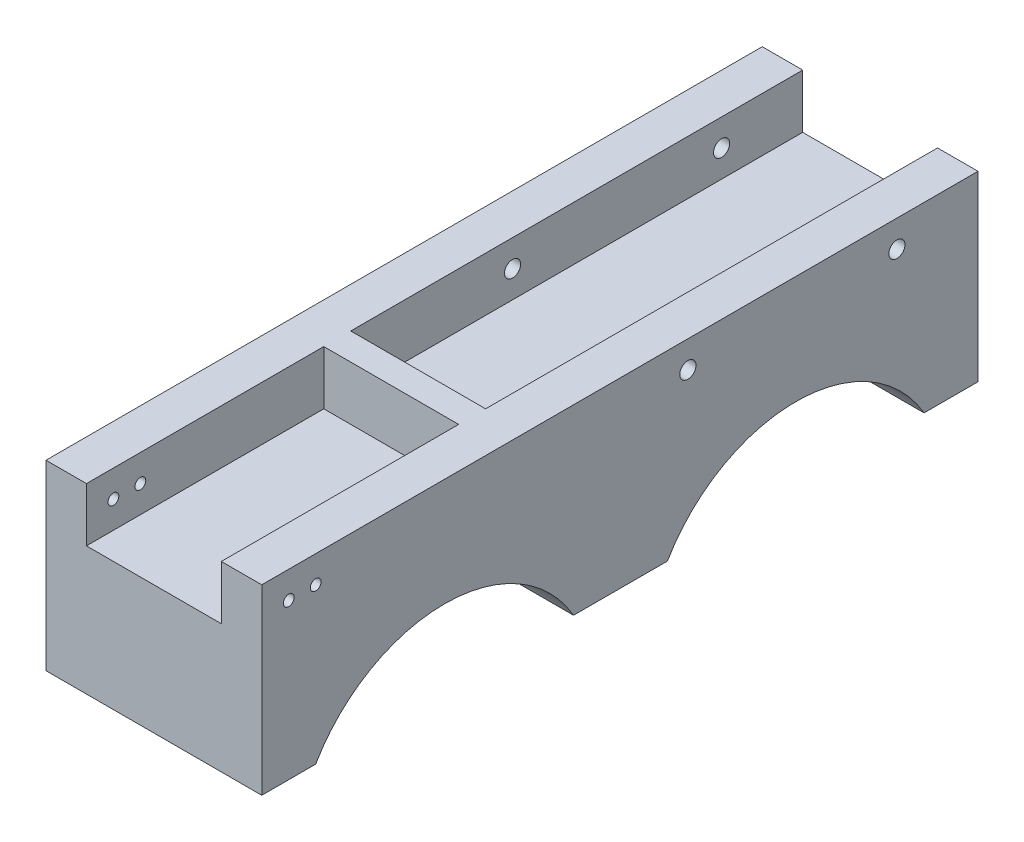
ISO-10303-21;
HEADER;
FILE_DESCRIPTION(('STEP AP214'),'2;1');
FILE_NAME('part.step','',(''),(''),'','','');
FILE_SCHEMA(('AUTOMOTIVE_DESIGN { 1 0 10303 214 1 1 1 1 }'));
ENDSEC;
DATA;
#1=APPLICATION_CONTEXT('core data for automotive mechanical design processes');
#2=APPLICATION_PROTOCOL_DEFINITION('international standard','automotive_design',2000,#1);
#3=PRODUCT_CONTEXT('',#1,'mechanical');
#4=PRODUCT('Part','Part','',(#3));
#5=PRODUCT_RELATED_PRODUCT_CATEGORY('part','',(#4));
#6=PRODUCT_DEFINITION_FORMATION('','',#4);
#7=PRODUCT_DEFINITION_CONTEXT('part definition',#1,'design');
#8=PRODUCT_DEFINITION('design','',#6,#7);
#9=PRODUCT_DEFINITION_SHAPE('','',#8);
#10=(LENGTH_UNIT() NAMED_UNIT(*) SI_UNIT(.MILLI.,.METRE.));
#11=(NAMED_UNIT(*) PLANE_ANGLE_UNIT() SI_UNIT($,.RADIAN.));
#12=(NAMED_UNIT(*) SI_UNIT($,.STERADIAN.) SOLID_ANGLE_UNIT());
#13=UNCERTAINTY_MEASURE_WITH_UNIT(LENGTH_MEASURE(1.E-05),#10,'distance_accuracy_value','');
#14=(GEOMETRIC_REPRESENTATION_CONTEXT(3) GLOBAL_UNCERTAINTY_ASSIGNED_CONTEXT((#13)) GLOBAL_UNIT_ASSIGNED_CONTEXT((#10,
#11,#12)) REPRESENTATION_CONTEXT('',''));
#15=CARTESIAN_POINT('',(0.,0.,0.));
#16=DIRECTION('',(0.,0.,1.));
#17=DIRECTION('',(1.,0.,0.));
#18=AXIS2_PLACEMENT_3D('',#15,#16,#17);
#19=CARTESIAN_POINT('',(65.,95.2,121.656250360246));
#20=DIRECTION('',(1.,0.,0.));
#21=DIRECTION('',(0.,0.,-1.));
#22=AXIS2_PLACEMENT_3D('',#19,#20,#21);
#23=PLANE('',#22);
#24=CARTESIAN_POINT('',(65.,85.2,-90.2));
#25=DIRECTION('',(1.,0.,0.));
#26=DIRECTION('',(0.,0.,-1.));
#27=AXIS2_PLACEMENT_3D('',#24,#25,#26);
#28=CIRCLE('',#27,3.00000000000001);
#29=CARTESIAN_POINT('',(65.,85.2,-93.2));
#30=VERTEX_POINT('',#29);
#31=EDGE_CURVE('E41',#30,#30,#28,.T.);
#32=ORIENTED_EDGE('',*,*,#31,.T.);
#33=EDGE_LOOP('',(#32));
#34=FACE_BOUND('',#33,.T.);
#35=CARTESIAN_POINT('',(65.,85.2,-167.7));
#36=DIRECTION('',(1.,0.,0.));
#37=DIRECTION('',(0.,0.,-1.));
#38=AXIS2_PLACEMENT_3D('',#35,#36,#37);
#39=CIRCLE('',#38,2.99999999999999);
#40=CARTESIAN_POINT('',(65.,85.2,-170.7));
#41=VERTEX_POINT('',#40);
#42=EDGE_CURVE('E293',#41,#41,#39,.T.);
#43=ORIENTED_EDGE('',*,*,#42,.T.);
#44=EDGE_LOOP('',(#43));
#45=FACE_BOUND('',#44,.T.);
#46=DIRECTION('',(0.,-1.,0.));
#47=VECTOR('',#46,1.);
#48=CARTESIAN_POINT('',(65.,146.190195135928,-30.2));
#49=LINE('',#48,#47);
#50=CARTESIAN_POINT('',(65.,95.2,-30.2));
#51=VERTEX_POINT('',#50);
#52=CARTESIAN_POINT('',(65.,75.2,-30.2));
#53=VERTEX_POINT('',#52);
#54=EDGE_CURVE('E54',#51,#53,#49,.T.);
#55=ORIENTED_EDGE('',*,*,#54,.F.);
#56=DIRECTION('',(0.,0.,-1.));
#57=VECTOR('',#56,1.);
#58=CARTESIAN_POINT('',(65.,95.2,121.656250360246));
#59=LINE('',#58,#57);
#60=CARTESIAN_POINT('',(65.,95.2,-197.773522047458));
#61=VERTEX_POINT('',#60);
#62=EDGE_CURVE('E269',#51,#61,#59,.T.);
#63=ORIENTED_EDGE('',*,*,#62,.T.);
#64=DIRECTION('',(0.,-1.,0.));
#65=VECTOR('',#64,1.);
#66=CARTESIAN_POINT('',(65.,95.2,-197.773522047458));
#67=LINE('',#66,#65);
#68=CARTESIAN_POINT('',(65.,75.2,-197.773522047458));
#69=VERTEX_POINT('',#68);
#70=EDGE_CURVE('E245',#61,#69,#67,.T.);
#71=ORIENTED_EDGE('',*,*,#70,.T.);
#72=DIRECTION('',(0.,0.,-1.));
#73=VECTOR('',#72,1.);
#74=CARTESIAN_POINT('',(65.,75.2,121.656250360246));
#75=LINE('',#74,#73);
#76=EDGE_CURVE('E210',#53,#69,#75,.T.);
#77=ORIENTED_EDGE('',*,*,#76,.F.);
#78=EDGE_LOOP('',(#55,#63,#71,#77));
#79=FACE_BOUND('',#78,.T.);
#80=ADVANCED_FACE('F37',(#34,#45,#79),#23,.F.);
#81=CARTESIAN_POINT('',(65.,85.2,57.804602288901));
#82=DIRECTION('',(1.,0.,0.));
#83=DIRECTION('',(0.,0.,-1.));
#84=AXIS2_PLACEMENT_3D('',#81,#82,#83);
#85=CIRCLE('',#84,2.);
#86=CARTESIAN_POINT('',(65.,85.2,55.804602288901));
#87=VERTEX_POINT('',#86);
#88=EDGE_CURVE('E287',#87,#87,#85,.T.);
#89=ORIENTED_EDGE('',*,*,#88,.T.);
#90=EDGE_LOOP('',(#89));
#91=FACE_BOUND('',#90,.T.);
#92=CARTESIAN_POINT('',(65.,85.2,47.804602288901));
#93=DIRECTION('',(1.,0.,0.));
#94=DIRECTION('',(0.,0.,-1.));
#95=AXIS2_PLACEMENT_3D('',#92,#93,#94);
#96=CIRCLE('',#95,2.);
#97=CARTESIAN_POINT('',(65.,85.2,45.804602288901));
#98=VERTEX_POINT('',#97);
#99=EDGE_CURVE('E290',#98,#98,#96,.T.);
#100=ORIENTED_EDGE('',*,*,#99,.T.);
#101=EDGE_LOOP('',(#100));
#102=FACE_BOUND('',#101,.T.);
#103=DIRECTION('',(0.,-1.,0.));
#104=VECTOR('',#103,1.);
#105=CARTESIAN_POINT('',(65.,146.190195135928,-20.2));
#106=LINE('',#105,#104);
#107=CARTESIAN_POINT('',(65.,95.2,-20.2));
#108=VERTEX_POINT('',#107);
#109=CARTESIAN_POINT('',(65.,75.2,-20.2));
#110=VERTEX_POINT('',#109);
#111=EDGE_CURVE('E213',#108,#110,#106,.T.);
#112=ORIENTED_EDGE('',*,*,#111,.T.);
#113=CARTESIAN_POINT('',(65.,75.2,67.804602288901));
#114=VERTEX_POINT('',#113);
#115=EDGE_CURVE('E201',#114,#110,#75,.T.);
#116=ORIENTED_EDGE('',*,*,#115,.F.);
#117=DIRECTION('',(0.,1.,0.));
#118=VECTOR('',#117,1.);
#119=CARTESIAN_POINT('',(65.,95.2,67.804602288901));
#120=LINE('',#119,#118);
#121=CARTESIAN_POINT('',(65.,95.2,67.804602288901));
#122=VERTEX_POINT('',#121);
#123=EDGE_CURVE('E258',#114,#122,#120,.T.);
#124=ORIENTED_EDGE('',*,*,#123,.T.);
#125=EDGE_CURVE('E62',#122,#108,#59,.T.);
#126=ORIENTED_EDGE('',*,*,#125,.T.);
#127=EDGE_LOOP('',(#112,#116,#124,#126));
#128=FACE_BOUND('',#127,.T.);
#129=ADVANCED_FACE('F214',(#91,#102,#128),#23,.F.);
#130=CARTESIAN_POINT('',(15.,95.2,121.656250360246));
#131=DIRECTION('',(-1.,0.,0.));
#132=DIRECTION('',(0.,-1.,0.));
#133=AXIS2_PLACEMENT_3D('',#130,#131,#132);
#134=PLANE('',#133);
#135=CARTESIAN_POINT('',(15.,85.2,-90.2));
#136=DIRECTION('',(-1.,0.,0.));
#137=DIRECTION('',(0.,-1.,0.));
#138=AXIS2_PLACEMENT_3D('',#135,#136,#137);
#139=CIRCLE('',#138,3.00000000000001);
#140=CARTESIAN_POINT('',(15.,82.2,-90.2));
#141=VERTEX_POINT('',#140);
#142=EDGE_CURVE('E277',#141,#141,#139,.T.);
#143=ORIENTED_EDGE('',*,*,#142,.T.);
#144=EDGE_LOOP('',(#143));
#145=FACE_BOUND('',#144,.T.);
#146=CARTESIAN_POINT('',(15.,85.2,-167.7));
#147=DIRECTION('',(-1.,0.,0.));
#148=DIRECTION('',(0.,-1.,0.));
#149=AXIS2_PLACEMENT_3D('',#146,#147,#148);
#150=CIRCLE('',#149,2.99999999999999);
#151=CARTESIAN_POINT('',(15.,82.2,-167.7));
#152=VERTEX_POINT('',#151);
#153=EDGE_CURVE('E284',#152,#152,#150,.T.);
#154=ORIENTED_EDGE('',*,*,#153,.T.);
#155=EDGE_LOOP('',(#154));
#156=FACE_BOUND('',#155,.T.);
#157=DIRECTION('',(0.,-1.,0.));
#158=VECTOR('',#157,1.);
#159=CARTESIAN_POINT('',(15.,146.190195135928,-30.2));
#160=LINE('',#159,#158);
#161=CARTESIAN_POINT('',(15.,95.2,-30.2));
#162=VERTEX_POINT('',#161);
#163=CARTESIAN_POINT('',(15.,75.2,-30.2));
#164=VERTEX_POINT('',#163);
#165=EDGE_CURVE('E224',#162,#164,#160,.T.);
#166=ORIENTED_EDGE('',*,*,#165,.T.);
#167=DIRECTION('',(0.,0.,-1.));
#168=VECTOR('',#167,1.);
#169=CARTESIAN_POINT('',(15.,75.2,121.656250360246));
#170=LINE('',#169,#168);
#171=CARTESIAN_POINT('',(15.,75.2,-197.773522047458));
#172=VERTEX_POINT('',#171);
#173=EDGE_CURVE('E209',#164,#172,#170,.T.);
#174=ORIENTED_EDGE('',*,*,#173,.T.);
#175=DIRECTION('',(0.,1.,0.));
#176=VECTOR('',#175,1.);
#177=CARTESIAN_POINT('',(15.,95.2,-197.773522047458));
#178=LINE('',#177,#176);
#179=CARTESIAN_POINT('',(15.,95.2,-197.773522047458));
#180=VERTEX_POINT('',#179);
#181=EDGE_CURVE('E265',#172,#180,#178,.T.);
#182=ORIENTED_EDGE('',*,*,#181,.T.);
#183=DIRECTION('',(0.,0.,-1.));
#184=VECTOR('',#183,1.);
#185=CARTESIAN_POINT('',(15.,95.2,121.656250360246));
#186=LINE('',#185,#184);
#187=EDGE_CURVE('E273',#162,#180,#186,.T.);
#188=ORIENTED_EDGE('',*,*,#187,.F.);
#189=EDGE_LOOP('',(#166,#174,#182,#188));
#190=FACE_BOUND('',#189,.T.);
#191=ADVANCED_FACE('F423',(#145,#156,#190),#134,.F.);
#192=CARTESIAN_POINT('',(15.,85.2,57.804602288901));
#193=DIRECTION('',(-1.,0.,0.));
#194=DIRECTION('',(0.,-1.,0.));
#195=AXIS2_PLACEMENT_3D('',#192,#193,#194);
#196=CIRCLE('',#195,2.);
#197=CARTESIAN_POINT('',(15.,83.2,57.804602288901));
#198=VERTEX_POINT('',#197);
#199=EDGE_CURVE('E278',#198,#198,#196,.T.);
#200=ORIENTED_EDGE('',*,*,#199,.T.);
#201=EDGE_LOOP('',(#200));
#202=FACE_BOUND('',#201,.T.);
#203=CARTESIAN_POINT('',(15.,85.2,47.804602288901));
#204=DIRECTION('',(-1.,0.,0.));
#205=DIRECTION('',(0.,-1.,0.));
#206=AXIS2_PLACEMENT_3D('',#203,#204,#205);
#207=CIRCLE('',#206,2.);
#208=CARTESIAN_POINT('',(15.,83.2,47.804602288901));
#209=VERTEX_POINT('',#208);
#210=EDGE_CURVE('E281',#209,#209,#207,.T.);
#211=ORIENTED_EDGE('',*,*,#210,.T.);
#212=EDGE_LOOP('',(#211));
#213=FACE_BOUND('',#212,.T.);
#214=DIRECTION('',(0.,-1.,0.));
#215=VECTOR('',#214,1.);
#216=CARTESIAN_POINT('',(15.,146.190195135928,-20.2));
#217=LINE('',#216,#215);
#218=CARTESIAN_POINT('',(15.,95.2,-20.2));
#219=VERTEX_POINT('',#218);
#220=CARTESIAN_POINT('',(15.,75.2,-20.2));
#221=VERTEX_POINT('',#220);
#222=EDGE_CURVE('E217',#219,#221,#217,.T.);
#223=ORIENTED_EDGE('',*,*,#222,.F.);
#224=CARTESIAN_POINT('',(15.,95.2,67.804602288901));
#225=VERTEX_POINT('',#224);
#226=EDGE_CURVE('E270',#225,#219,#186,.T.);
#227=ORIENTED_EDGE('',*,*,#226,.F.);
#228=DIRECTION('',(0.,-1.,0.));
#229=VECTOR('',#228,1.);
#230=CARTESIAN_POINT('',(15.,95.2,67.804602288901));
#231=LINE('',#230,#229);
#232=CARTESIAN_POINT('',(15.,75.2,67.804602288901));
#233=VERTEX_POINT('',#232);
#234=EDGE_CURVE('E255',#225,#233,#231,.T.);
#235=ORIENTED_EDGE('',*,*,#234,.T.);
#236=EDGE_CURVE('E274',#233,#221,#170,.T.);
#237=ORIENTED_EDGE('',*,*,#236,.T.);
#238=EDGE_LOOP('',(#223,#227,#235,#237));
#239=FACE_BOUND('',#238,.T.);
#240=ADVANCED_FACE('F692',(#202,#213,#239),#134,.F.);
#241=CARTESIAN_POINT('',(65.,75.2,121.656250360246));
#242=DIRECTION('',(0.,-1.,0.));
#243=DIRECTION('',(1.,0.,0.));
#244=AXIS2_PLACEMENT_3D('',#241,#242,#243);
#245=PLANE('',#244);
#246=DIRECTION('',(-1.,0.,0.));
#247=VECTOR('',#246,1.);
#248=CARTESIAN_POINT('',(15.,75.2,-30.2));
#249=LINE('',#248,#247);
#250=EDGE_CURVE('E221',#53,#164,#249,.T.);
#251=ORIENTED_EDGE('',*,*,#250,.F.);
#252=ORIENTED_EDGE('',*,*,#76,.T.);
#253=DIRECTION('',(-1.,0.,0.));
#254=VECTOR('',#253,1.);
#255=CARTESIAN_POINT('',(65.,75.2,-197.773522047458));
#256=LINE('',#255,#254);
#257=EDGE_CURVE('E262',#69,#172,#256,.T.);
#258=ORIENTED_EDGE('',*,*,#257,.T.);
#259=ORIENTED_EDGE('',*,*,#173,.F.);
#260=EDGE_LOOP('',(#251,#252,#258,#259));
#261=FACE_BOUND('',#260,.T.);
#262=ADVANCED_FACE('F461',(#261),#245,.F.);
#263=DIRECTION('',(1.,0.,0.));
#264=VECTOR('',#263,1.);
#265=CARTESIAN_POINT('',(15.,75.2,-20.2));
#266=LINE('',#265,#264);
#267=EDGE_CURVE('E204',#221,#110,#266,.T.);
#268=ORIENTED_EDGE('',*,*,#267,.F.);
#269=ORIENTED_EDGE('',*,*,#236,.F.);
#270=DIRECTION('',(1.,0.,0.));
#271=VECTOR('',#270,1.);
#272=CARTESIAN_POINT('',(65.,75.2,67.804602288901));
#273=LINE('',#272,#271);
#274=EDGE_CURVE('E207',#233,#114,#273,.T.);
#275=ORIENTED_EDGE('',*,*,#274,.T.);
#276=ORIENTED_EDGE('',*,*,#115,.T.);
#277=EDGE_LOOP('',(#268,#269,#275,#276));
#278=FACE_BOUND('',#277,.T.);
#279=ADVANCED_FACE('F202',(#278),#245,.F.);
#280=CARTESIAN_POINT('',(80.,85.2,-167.7));
#281=DIRECTION('',(-1.,0.,0.));
#282=DIRECTION('',(0.,0.,1.));
#283=AXIS2_PLACEMENT_3D('',#280,#281,#282);
#284=CYLINDRICAL_SURFACE('',#283,2.99999999999999);
#285=ORIENTED_EDGE('',*,*,#42,.F.);
#286=EDGE_LOOP('',(#285));
#287=FACE_BOUND('',#286,.T.);
#288=CARTESIAN_POINT('',(80.,85.2,-167.7));
#289=DIRECTION('',(1.,0.,0.));
#290=DIRECTION('',(0.,0.,-1.));
#291=AXIS2_PLACEMENT_3D('',#288,#289,#290);
#292=CIRCLE('',#291,2.99999999999999);
#293=CARTESIAN_POINT('',(80.,85.2,-170.7));
#294=VERTEX_POINT('',#293);
#295=EDGE_CURVE('E334',#294,#294,#292,.T.);
#296=ORIENTED_EDGE('',*,*,#295,.T.);
#297=EDGE_LOOP('',(#296));
#298=FACE_BOUND('',#297,.T.);
#299=ADVANCED_FACE('F484',(#287,#298),#284,.F.);
#300=CARTESIAN_POINT('',(80.,85.2,47.804602288901));
#301=DIRECTION('',(-1.,0.,0.));
#302=DIRECTION('',(0.,0.,1.));
#303=AXIS2_PLACEMENT_3D('',#300,#301,#302);
#304=CYLINDRICAL_SURFACE('',#303,2.);
#305=ORIENTED_EDGE('',*,*,#99,.F.);
#306=EDGE_LOOP('',(#305));
#307=FACE_BOUND('',#306,.T.);
#308=CARTESIAN_POINT('',(80.,85.2,47.804602288901));
#309=DIRECTION('',(1.,0.,0.));
#310=DIRECTION('',(0.,0.,-1.));
#311=AXIS2_PLACEMENT_3D('',#308,#309,#310);
#312=CIRCLE('',#311,2.);
#313=CARTESIAN_POINT('',(80.,85.2,45.804602288901));
#314=VERTEX_POINT('',#313);
#315=EDGE_CURVE('E328',#314,#314,#312,.T.);
#316=ORIENTED_EDGE('',*,*,#315,.T.);
#317=EDGE_LOOP('',(#316));
#318=FACE_BOUND('',#317,.T.);
#319=ADVANCED_FACE('F480',(#307,#318),#304,.F.);
#320=CARTESIAN_POINT('',(80.,85.2,57.804602288901));
#321=DIRECTION('',(-1.,0.,0.));
#322=DIRECTION('',(0.,0.,1.));
#323=AXIS2_PLACEMENT_3D('',#320,#321,#322);
#324=CYLINDRICAL_SURFACE('',#323,2.);
#325=ORIENTED_EDGE('',*,*,#88,.F.);
#326=EDGE_LOOP('',(#325));
#327=FACE_BOUND('',#326,.T.);
#328=CARTESIAN_POINT('',(80.,85.2,57.804602288901));
#329=DIRECTION('',(1.,0.,0.));
#330=DIRECTION('',(0.,0.,-1.));
#331=AXIS2_PLACEMENT_3D('',#328,#329,#330);
#332=CIRCLE('',#331,2.);
#333=CARTESIAN_POINT('',(80.,85.2,55.804602288901));
#334=VERTEX_POINT('',#333);
#335=EDGE_CURVE('E322',#334,#334,#332,.T.);
#336=ORIENTED_EDGE('',*,*,#335,.T.);
#337=EDGE_LOOP('',(#336));
#338=FACE_BOUND('',#337,.T.);
#339=ADVANCED_FACE('F475',(#327,#338),#324,.F.);
#340=CARTESIAN_POINT('',(80.,85.2,-90.2));
#341=DIRECTION('',(-1.,0.,0.));
#342=DIRECTION('',(0.,0.,1.));
#343=AXIS2_PLACEMENT_3D('',#340,#341,#342);
#344=CYLINDRICAL_SURFACE('',#343,3.00000000000001);
#345=ORIENTED_EDGE('',*,*,#31,.F.);
#346=EDGE_LOOP('',(#345));
#347=FACE_BOUND('',#346,.T.);
#348=CARTESIAN_POINT('',(80.,85.2,-90.2));
#349=DIRECTION('',(1.,0.,0.));
#350=DIRECTION('',(0.,0.,-1.));
#351=AXIS2_PLACEMENT_3D('',#348,#349,#350);
#352=CIRCLE('',#351,3.00000000000001);
#353=CARTESIAN_POINT('',(80.,85.2,-93.2));
#354=VERTEX_POINT('',#353);
#355=EDGE_CURVE('E316',#354,#354,#352,.T.);
#356=ORIENTED_EDGE('',*,*,#355,.T.);
#357=EDGE_LOOP('',(#356));
#358=FACE_BOUND('',#357,.T.);
#359=ADVANCED_FACE('F432',(#347,#358),#344,.F.);
#360=CARTESIAN_POINT('',(80.,0.,0.));
#361=DIRECTION('',(-1.,0.,0.));
#362=DIRECTION('',(0.,0.,1.));
#363=AXIS2_PLACEMENT_3D('',#360,#361,#362);
#364=PLANE('',#363);
#365=CARTESIAN_POINT('',(80.,0.,-130.2));
#366=DIRECTION('',(-1.,0.,0.));
#367=DIRECTION('',(0.,0.,1.));
#368=AXIS2_PLACEMENT_3D('',#365,#366,#367);
#369=CIRCLE('',#368,55.);
#370=CARTESIAN_POINT('',(80.,27.6000000000001,-82.6264779525417));
#371=VERTEX_POINT('',#370);
#372=CARTESIAN_POINT('',(80.,27.6000000000001,-177.773522047458));
#373=VERTEX_POINT('',#372);
#374=EDGE_CURVE('E345',#371,#373,#369,.T.);
#375=ORIENTED_EDGE('',*,*,#374,.T.);
#376=DIRECTION('',(0.,0.,-1.));
#377=VECTOR('',#376,1.);
#378=CARTESIAN_POINT('',(80.,27.6000000000001,-177.773522047458));
#379=LINE('',#378,#377);
#380=CARTESIAN_POINT('',(80.,27.6000000000001,-197.773522047458));
#381=VERTEX_POINT('',#380);
#382=EDGE_CURVE('E347',#373,#381,#379,.T.);
#383=ORIENTED_EDGE('',*,*,#382,.T.);
#384=DIRECTION('',(0.,1.,0.));
#385=VECTOR('',#384,1.);
#386=CARTESIAN_POINT('',(80.,27.6000000000001,-197.773522047458));
#387=LINE('',#386,#385);
#388=CARTESIAN_POINT('',(80.,95.2,-197.773522047458));
#389=VERTEX_POINT('',#388);
#390=EDGE_CURVE('E349',#381,#389,#387,.T.);
#391=ORIENTED_EDGE('',*,*,#390,.T.);
#392=DIRECTION('',(0.,0.,1.));
#393=VECTOR('',#392,1.);
#394=CARTESIAN_POINT('',(80.,95.2,67.804602288901));
#395=LINE('',#394,#393);
#396=CARTESIAN_POINT('',(80.,95.2,67.804602288901));
#397=VERTEX_POINT('',#396);
#398=EDGE_CURVE('E351',#389,#397,#395,.T.);
#399=ORIENTED_EDGE('',*,*,#398,.T.);
#400=DIRECTION('',(0.,-1.,0.));
#401=VECTOR('',#400,1.);
#402=CARTESIAN_POINT('',(80.,27.6000000000001,67.804602288901));
#403=LINE('',#402,#401);
#404=CARTESIAN_POINT('',(80.,27.6000000000001,67.804602288901));
#405=VERTEX_POINT('',#404);
#406=EDGE_CURVE('E353',#397,#405,#403,.T.);
#407=ORIENTED_EDGE('',*,*,#406,.T.);
#408=DIRECTION('',(0.,0.,-1.));
#409=VECTOR('',#408,1.);
#410=CARTESIAN_POINT('',(80.,27.6000000000001,47.804602288901));
#411=LINE('',#410,#409);
#412=CARTESIAN_POINT('',(80.,27.6000000000001,47.804602288901));
#413=VERTEX_POINT('',#412);
#414=EDGE_CURVE('E355',#405,#413,#411,.T.);
#415=ORIENTED_EDGE('',*,*,#414,.T.);
#416=CARTESIAN_POINT('',(80.,0.,0.));
#417=DIRECTION('',(-1.,0.,0.));
#418=DIRECTION('',(0.,0.,1.));
#419=AXIS2_PLACEMENT_3D('',#416,#417,#418);
#420=CIRCLE('',#419,55.2);
#421=CARTESIAN_POINT('',(80.,27.6000000000001,-47.804602288901));
#422=VERTEX_POINT('',#421);
#423=EDGE_CURVE('E340',#413,#422,#420,.T.);
#424=ORIENTED_EDGE('',*,*,#423,.T.);
#425=DIRECTION('',(0.,0.,-1.));
#426=VECTOR('',#425,1.);
#427=CARTESIAN_POINT('',(80.,27.6000000000001,-47.804602288901));
#428=LINE('',#427,#426);
#429=EDGE_CURVE('E342',#422,#371,#428,.T.);
#430=ORIENTED_EDGE('',*,*,#429,.T.);
#431=EDGE_LOOP('',(#375,#383,#391,#399,#407,#415,#424,#430));
#432=FACE_BOUND('',#431,.T.);
#433=ORIENTED_EDGE('',*,*,#295,.F.);
#434=EDGE_LOOP('',(#433));
#435=FACE_BOUND('',#434,.T.);
#436=ORIENTED_EDGE('',*,*,#315,.F.);
#437=EDGE_LOOP('',(#436));
#438=FACE_BOUND('',#437,.T.);
#439=ORIENTED_EDGE('',*,*,#335,.F.);
#440=EDGE_LOOP('',(#439));
#441=FACE_BOUND('',#440,.T.);
#442=ORIENTED_EDGE('',*,*,#355,.F.);
#443=EDGE_LOOP('',(#442));
#444=FACE_BOUND('',#443,.T.);
#445=ADVANCED_FACE('F437',(#432,#435,#438,#441,#444),#364,.F.);
#446=CARTESIAN_POINT('',(0.,0.,0.));
#447=DIRECTION('',(-1.,0.,0.));
#448=DIRECTION('',(0.,0.,1.));
#449=AXIS2_PLACEMENT_3D('',#446,#447,#448);
#450=PLANE('',#449);
#451=CARTESIAN_POINT('',(0.,0.,-130.2));
#452=DIRECTION('',(-1.,0.,0.));
#453=DIRECTION('',(0.,0.,1.));
#454=AXIS2_PLACEMENT_3D('',#451,#452,#453);
#455=CIRCLE('',#454,55.);
#456=CARTESIAN_POINT('',(0.,27.6000000000001,-82.6264779525417));
#457=VERTEX_POINT('',#456);
#458=CARTESIAN_POINT('',(0.,27.6000000000001,-177.773522047458));
#459=VERTEX_POINT('',#458);
#460=EDGE_CURVE('E362',#457,#459,#455,.T.);
#461=ORIENTED_EDGE('',*,*,#460,.F.);
#462=DIRECTION('',(0.,0.,-1.));
#463=VECTOR('',#462,1.);
#464=CARTESIAN_POINT('',(0.,27.6000000000001,-47.804602288901));
#465=LINE('',#464,#463);
#466=CARTESIAN_POINT('',(0.,27.6000000000001,-47.804602288901));
#467=VERTEX_POINT('',#466);
#468=EDGE_CURVE('E359',#467,#457,#465,.T.);
#469=ORIENTED_EDGE('',*,*,#468,.F.);
#470=CARTESIAN_POINT('',(0.,0.,0.));
#471=DIRECTION('',(-1.,0.,0.));
#472=DIRECTION('',(0.,0.,1.));
#473=AXIS2_PLACEMENT_3D('',#470,#471,#472);
#474=CIRCLE('',#473,55.2);
#475=CARTESIAN_POINT('',(0.,27.6000000000001,47.804602288901));
#476=VERTEX_POINT('',#475);
#477=EDGE_CURVE('E337',#476,#467,#474,.T.);
#478=ORIENTED_EDGE('',*,*,#477,.F.);
#479=DIRECTION('',(0.,0.,-1.));
#480=VECTOR('',#479,1.);
#481=CARTESIAN_POINT('',(0.,27.6000000000001,47.804602288901));
#482=LINE('',#481,#480);
#483=CARTESIAN_POINT('',(0.,27.6000000000001,67.804602288901));
#484=VERTEX_POINT('',#483);
#485=EDGE_CURVE('E343',#484,#476,#482,.T.);
#486=ORIENTED_EDGE('',*,*,#485,.F.);
#487=DIRECTION('',(0.,-1.,0.));
#488=VECTOR('',#487,1.);
#489=CARTESIAN_POINT('',(0.,27.6000000000001,67.804602288901));
#490=LINE('',#489,#488);
#491=CARTESIAN_POINT('',(0.,95.2,67.804602288901));
#492=VERTEX_POINT('',#491);
#493=EDGE_CURVE('E372',#492,#484,#490,.T.);
#494=ORIENTED_EDGE('',*,*,#493,.F.);
#495=DIRECTION('',(0.,0.,1.));
#496=VECTOR('',#495,1.);
#497=CARTESIAN_POINT('',(0.,95.2,67.804602288901));
#498=LINE('',#497,#496);
#499=CARTESIAN_POINT('',(0.,95.2,-197.773522047458));
#500=VERTEX_POINT('',#499);
#501=EDGE_CURVE('E369',#500,#492,#498,.T.);
#502=ORIENTED_EDGE('',*,*,#501,.F.);
#503=DIRECTION('',(0.,1.,0.));
#504=VECTOR('',#503,1.);
#505=CARTESIAN_POINT('',(0.,27.6000000000001,-197.773522047458));
#506=LINE('',#505,#504);
#507=CARTESIAN_POINT('',(0.,27.6000000000001,-197.773522047458));
#508=VERTEX_POINT('',#507);
#509=EDGE_CURVE('E366',#508,#500,#506,.T.);
#510=ORIENTED_EDGE('',*,*,#509,.F.);
#511=DIRECTION('',(0.,0.,-1.));
#512=VECTOR('',#511,1.);
#513=CARTESIAN_POINT('',(0.,27.6000000000001,-177.773522047458));
#514=LINE('',#513,#512);
#515=EDGE_CURVE('E364',#459,#508,#514,.T.);
#516=ORIENTED_EDGE('',*,*,#515,.F.);
#517=EDGE_LOOP('',(#461,#469,#478,#486,#494,#502,#510,#516));
#518=FACE_BOUND('',#517,.T.);
#519=CARTESIAN_POINT('',(0.,85.2,57.804602288901));
#520=DIRECTION('',(1.,0.,0.));
#521=DIRECTION('',(0.,0.,-1.));
#522=AXIS2_PLACEMENT_3D('',#519,#520,#521);
#523=CIRCLE('',#522,2.);
#524=CARTESIAN_POINT('',(0.,85.2,55.804602288901));
#525=VERTEX_POINT('',#524);
#526=EDGE_CURVE('E319',#525,#525,#523,.T.);
#527=ORIENTED_EDGE('',*,*,#526,.T.);
#528=EDGE_LOOP('',(#527));
#529=FACE_BOUND('',#528,.T.);
#530=CARTESIAN_POINT('',(0.,85.2,-167.7));
#531=DIRECTION('',(1.,0.,0.));
#532=DIRECTION('',(0.,0.,-1.));
#533=AXIS2_PLACEMENT_3D('',#530,#531,#532);
#534=CIRCLE('',#533,2.99999999999999);
#535=CARTESIAN_POINT('',(0.,85.2,-170.7));
#536=VERTEX_POINT('',#535);
#537=EDGE_CURVE('E331',#536,#536,#534,.T.);
#538=ORIENTED_EDGE('',*,*,#537,.T.);
#539=EDGE_LOOP('',(#538));
#540=FACE_BOUND('',#539,.T.);
#541=CARTESIAN_POINT('',(0.,85.2,47.804602288901));
#542=DIRECTION('',(1.,0.,0.));
#543=DIRECTION('',(0.,0.,-1.));
#544=AXIS2_PLACEMENT_3D('',#541,#542,#543);
#545=CIRCLE('',#544,2.);
#546=CARTESIAN_POINT('',(0.,85.2,45.804602288901));
#547=VERTEX_POINT('',#546);
#548=EDGE_CURVE('E325',#547,#547,#545,.T.);
#549=ORIENTED_EDGE('',*,*,#548,.T.);
#550=EDGE_LOOP('',(#549));
#551=FACE_BOUND('',#550,.T.);
#552=CARTESIAN_POINT('',(0.,85.2,-90.2));
#553=DIRECTION('',(1.,0.,0.));
#554=DIRECTION('',(0.,0.,-1.));
#555=AXIS2_PLACEMENT_3D('',#552,#553,#554);
#556=CIRCLE('',#555,3.00000000000001);
#557=CARTESIAN_POINT('',(0.,85.2,-93.2));
#558=VERTEX_POINT('',#557);
#559=EDGE_CURVE('E307',#558,#558,#556,.T.);
#560=ORIENTED_EDGE('',*,*,#559,.T.);
#561=EDGE_LOOP('',(#560));
#562=FACE_BOUND('',#561,.T.);
#563=ADVANCED_FACE('F435',(#518,#529,#540,#551,#562),#450,.T.);
#564=CARTESIAN_POINT('',(80.,54.2866466085353,10.));
#565=DIRECTION('',(0.,0.,-1.));
#566=DIRECTION('',(0.,1.,0.));
#567=AXIS2_PLACEMENT_3D('',#564,#565,#566);
#568=PLANE('',#567);
#569=DIRECTION('',(-1.,0.,0.));
#570=VECTOR('',#569,1.);
#571=CARTESIAN_POINT('',(80.,54.2866466085353,10.));
#572=LINE('',#571,#570);
#573=CARTESIAN_POINT('',(65.,54.2866466085353,10.));
#574=VERTEX_POINT('',#573);
#575=CARTESIAN_POINT('',(15.,54.2866466085353,10.));
#576=VERTEX_POINT('',#575);
#577=EDGE_CURVE('E11',#574,#576,#572,.T.);
#578=ORIENTED_EDGE('',*,*,#577,.T.);
#579=DIRECTION('',(0.,-1.,0.));
#580=VECTOR('',#579,1.);
#581=CARTESIAN_POINT('',(15.,95.201,10.));
#582=LINE('',#581,#580);
#583=CARTESIAN_POINT('',(15.,45.2,10.));
#584=VERTEX_POINT('',#583);
#585=EDGE_CURVE('E304',#576,#584,#582,.T.);
#586=ORIENTED_EDGE('',*,*,#585,.T.);
#587=DIRECTION('',(-1.,0.,0.));
#588=VECTOR('',#587,1.);
#589=CARTESIAN_POINT('',(80.,45.2,10.));
#590=LINE('',#589,#588);
#591=CARTESIAN_POINT('',(65.,45.2,10.));
#592=VERTEX_POINT('',#591);
#593=EDGE_CURVE('E46',#592,#584,#590,.T.);
#594=ORIENTED_EDGE('',*,*,#593,.F.);
#595=DIRECTION('',(0.,-1.,0.));
#596=VECTOR('',#595,1.);
#597=CARTESIAN_POINT('',(65.,95.201,10.));
#598=LINE('',#597,#596);
#599=EDGE_CURVE('E310',#574,#592,#598,.T.);
#600=ORIENTED_EDGE('',*,*,#599,.F.);
#601=EDGE_LOOP('',(#578,#586,#594,#600));
#602=FACE_BOUND('',#601,.T.);
#603=ADVANCED_FACE('F39',(#602),#568,.F.);
#604=CARTESIAN_POINT('',(80.,45.2,10.));
#605=DIRECTION('',(0.,1.,0.));
#606=DIRECTION('',(0.,0.,1.));
#607=AXIS2_PLACEMENT_3D('',#604,#605,#606);
#608=PLANE('',#607);
#609=ORIENTED_EDGE('',*,*,#593,.T.);
#610=DIRECTION('',(0.,0.,1.));
#611=VECTOR('',#610,1.);
#612=CARTESIAN_POINT('',(15.,45.2,-10.));
#613=LINE('',#612,#611);
#614=CARTESIAN_POINT('',(15.,45.2,-10.));
#615=VERTEX_POINT('',#614);
#616=EDGE_CURVE('E297',#615,#584,#613,.T.);
#617=ORIENTED_EDGE('',*,*,#616,.F.);
#618=DIRECTION('',(-1.,0.,0.));
#619=VECTOR('',#618,1.);
#620=CARTESIAN_POINT('',(80.,45.2,-10.));
#621=LINE('',#620,#619);
#622=CARTESIAN_POINT('',(65.,45.2,-10.));
#623=VERTEX_POINT('',#622);
#624=EDGE_CURVE('E416',#623,#615,#621,.T.);
#625=ORIENTED_EDGE('',*,*,#624,.F.);
#626=DIRECTION('',(0.,0.,-1.));
#627=VECTOR('',#626,1.);
#628=CARTESIAN_POINT('',(65.,45.2,-10.));
#629=LINE('',#628,#627);
#630=EDGE_CURVE('E296',#592,#623,#629,.T.);
#631=ORIENTED_EDGE('',*,*,#630,.F.);
#632=EDGE_LOOP('',(#609,#617,#625,#631));
#633=FACE_BOUND('',#632,.T.);
#634=ADVANCED_FACE('F444',(#633),#608,.F.);
#635=CARTESIAN_POINT('',(80.,45.2,-10.));
#636=DIRECTION('',(0.,0.,1.));
#637=DIRECTION('',(0.,-1.,0.));
#638=AXIS2_PLACEMENT_3D('',#635,#636,#637);
#639=PLANE('',#638);
#640=ORIENTED_EDGE('',*,*,#624,.T.);
#641=DIRECTION('',(0.,-1.,0.));
#642=VECTOR('',#641,1.);
#643=CARTESIAN_POINT('',(15.,95.201,-10.));
#644=LINE('',#643,#642);
#645=CARTESIAN_POINT('',(15.,54.2866466085353,-10.));
#646=VERTEX_POINT('',#645);
#647=EDGE_CURVE('E299',#646,#615,#644,.T.);
#648=ORIENTED_EDGE('',*,*,#647,.F.);
#649=DIRECTION('',(-1.,0.,0.));
#650=VECTOR('',#649,1.);
#651=CARTESIAN_POINT('',(80.,54.2866466085353,-10.));
#652=LINE('',#651,#650);
#653=CARTESIAN_POINT('',(65.,54.2866466085353,-10.));
#654=VERTEX_POINT('',#653);
#655=EDGE_CURVE('E413',#654,#646,#652,.T.);
#656=ORIENTED_EDGE('',*,*,#655,.F.);
#657=DIRECTION('',(0.,-1.,0.));
#658=VECTOR('',#657,1.);
#659=CARTESIAN_POINT('',(65.,95.201,-10.));
#660=LINE('',#659,#658);
#661=EDGE_CURVE('E300',#654,#623,#660,.T.);
#662=ORIENTED_EDGE('',*,*,#661,.T.);
#663=EDGE_LOOP('',(#640,#648,#656,#662));
#664=FACE_BOUND('',#663,.T.);
#665=ADVANCED_FACE('F558',(#664),#639,.F.);
#666=CARTESIAN_POINT('',(80.,0.,0.));
#667=DIRECTION('',(-1.,0.,0.));
#668=DIRECTION('',(0.,0.,1.));
#669=AXIS2_PLACEMENT_3D('',#666,#667,#668);
#670=CYLINDRICAL_SURFACE('',#669,55.2);
#671=DIRECTION('',(-1.,0.,0.));
#672=VECTOR('',#671,1.);
#673=CARTESIAN_POINT('',(80.,27.6000000000001,47.804602288901));
#674=LINE('',#673,#672);
#675=EDGE_CURVE('E357',#413,#476,#674,.T.);
#676=ORIENTED_EDGE('',*,*,#675,.T.);
#677=ORIENTED_EDGE('',*,*,#477,.T.);
#678=DIRECTION('',(-1.,0.,0.));
#679=VECTOR('',#678,1.);
#680=CARTESIAN_POINT('',(80.,27.6000000000001,-47.804602288901));
#681=LINE('',#680,#679);
#682=EDGE_CURVE('E410',#422,#467,#681,.T.);
#683=ORIENTED_EDGE('',*,*,#682,.F.);
#684=ORIENTED_EDGE('',*,*,#423,.F.);
#685=EDGE_LOOP('',(#676,#677,#683,#684));
#686=FACE_BOUND('',#685,.T.);
#687=CARTESIAN_POINT('',(15.,0.,0.));
#688=DIRECTION('',(1.,0.,0.));
#689=DIRECTION('',(0.,0.,-1.));
#690=AXIS2_PLACEMENT_3D('',#687,#688,#689);
#691=CIRCLE('',#690,55.2);
#692=EDGE_CURVE('E301',#646,#576,#691,.T.);
#693=ORIENTED_EDGE('',*,*,#692,.T.);
#694=ORIENTED_EDGE('',*,*,#577,.F.);
#695=CARTESIAN_POINT('',(65.,0.,0.));
#696=DIRECTION('',(-1.,0.,0.));
#697=DIRECTION('',(0.,0.,1.));
#698=AXIS2_PLACEMENT_3D('',#695,#696,#697);
#699=CIRCLE('',#698,55.2);
#700=EDGE_CURVE('E311',#574,#654,#699,.T.);
#701=ORIENTED_EDGE('',*,*,#700,.T.);
#702=ORIENTED_EDGE('',*,*,#655,.T.);
#703=EDGE_LOOP('',(#693,#694,#701,#702));
#704=FACE_BOUND('',#703,.T.);
#705=ADVANCED_FACE('F553',(#686,#704),#670,.F.);
#706=CARTESIAN_POINT('',(80.,27.6000000000001,-47.804602288901));
#707=DIRECTION('',(0.,1.,0.));
#708=DIRECTION('',(0.,0.,1.));
#709=AXIS2_PLACEMENT_3D('',#706,#707,#708);
#710=PLANE('',#709);
#711=ORIENTED_EDGE('',*,*,#468,.T.);
#712=DIRECTION('',(-1.,0.,0.));
#713=VECTOR('',#712,1.);
#714=CARTESIAN_POINT('',(80.,27.6000000000001,-82.6264779525417));
#715=LINE('',#714,#713);
#716=EDGE_CURVE('E407',#371,#457,#715,.T.);
#717=ORIENTED_EDGE('',*,*,#716,.F.);
#718=ORIENTED_EDGE('',*,*,#429,.F.);
#719=ORIENTED_EDGE('',*,*,#682,.T.);
#720=EDGE_LOOP('',(#711,#717,#718,#719));
#721=FACE_BOUND('',#720,.T.);
#722=ADVANCED_FACE('F557',(#721),#710,.F.);
#723=CARTESIAN_POINT('',(80.,54.0832691319598,-120.2));
#724=DIRECTION('',(0.,0.,-1.));
#725=DIRECTION('',(0.,1.,0.));
#726=AXIS2_PLACEMENT_3D('',#723,#724,#725);
#727=PLANE('',#726);
#728=DIRECTION('',(-1.,0.,0.));
#729=VECTOR('',#728,1.);
#730=CARTESIAN_POINT('',(80.,54.0832691319598,-120.2));
#731=LINE('',#730,#729);
#732=CARTESIAN_POINT('',(65.,54.0832691319598,-120.2));
#733=VERTEX_POINT('',#732);
#734=CARTESIAN_POINT('',(15.,54.0832691319598,-120.2));
#735=VERTEX_POINT('',#734);
#736=EDGE_CURVE('E404',#733,#735,#731,.T.);
#737=ORIENTED_EDGE('',*,*,#736,.T.);
#738=DIRECTION('',(0.,-1.,0.));
#739=VECTOR('',#738,1.);
#740=CARTESIAN_POINT('',(15.,95.2010000000001,-120.2));
#741=LINE('',#740,#739);
#742=CARTESIAN_POINT('',(15.,45.2,-120.2));
#743=VERTEX_POINT('',#742);
#744=EDGE_CURVE('E242',#735,#743,#741,.T.);
#745=ORIENTED_EDGE('',*,*,#744,.T.);
#746=DIRECTION('',(-1.,0.,0.));
#747=VECTOR('',#746,1.);
#748=CARTESIAN_POINT('',(80.,45.2,-120.2));
#749=LINE('',#748,#747);
#750=CARTESIAN_POINT('',(65.,45.2,-120.2));
#751=VERTEX_POINT('',#750);
#752=EDGE_CURVE('E401',#751,#743,#749,.T.);
#753=ORIENTED_EDGE('',*,*,#752,.F.);
#754=DIRECTION('',(0.,-1.,0.));
#755=VECTOR('',#754,1.);
#756=CARTESIAN_POINT('',(65.,95.2010000000001,-120.2));
#757=LINE('',#756,#755);
#758=EDGE_CURVE('E249',#733,#751,#757,.T.);
#759=ORIENTED_EDGE('',*,*,#758,.F.);
#760=EDGE_LOOP('',(#737,#745,#753,#759));
#761=FACE_BOUND('',#760,.T.);
#762=ADVANCED_FACE('F618',(#761),#727,.F.);
#763=CARTESIAN_POINT('',(80.,45.2,-120.2));
#764=DIRECTION('',(0.,1.,0.));
#765=DIRECTION('',(0.,0.,1.));
#766=AXIS2_PLACEMENT_3D('',#763,#764,#765);
#767=PLANE('',#766);
#768=ORIENTED_EDGE('',*,*,#752,.T.);
#769=DIRECTION('',(0.,0.,1.));
#770=VECTOR('',#769,1.);
#771=CARTESIAN_POINT('',(15.,45.2,-120.2));
#772=LINE('',#771,#770);
#773=CARTESIAN_POINT('',(15.,45.2,-140.2));
#774=VERTEX_POINT('',#773);
#775=EDGE_CURVE('E235',#774,#743,#772,.T.);
#776=ORIENTED_EDGE('',*,*,#775,.F.);
#777=DIRECTION('',(-1.,0.,0.));
#778=VECTOR('',#777,1.);
#779=CARTESIAN_POINT('',(80.,45.2,-140.2));
#780=LINE('',#779,#778);
#781=CARTESIAN_POINT('',(65.,45.2,-140.2));
#782=VERTEX_POINT('',#781);
#783=EDGE_CURVE('E398',#782,#774,#780,.T.);
#784=ORIENTED_EDGE('',*,*,#783,.F.);
#785=DIRECTION('',(0.,0.,-1.));
#786=VECTOR('',#785,1.);
#787=CARTESIAN_POINT('',(65.,45.2,-120.2));
#788=LINE('',#787,#786);
#789=EDGE_CURVE('E247',#751,#782,#788,.T.);
#790=ORIENTED_EDGE('',*,*,#789,.F.);
#791=EDGE_LOOP('',(#768,#776,#784,#790));
#792=FACE_BOUND('',#791,.T.);
#793=ADVANCED_FACE('F629',(#792),#767,.F.);
#794=CARTESIAN_POINT('',(80.,45.2,-140.2));
#795=DIRECTION('',(0.,0.,1.));
#796=DIRECTION('',(0.,-1.,0.));
#797=AXIS2_PLACEMENT_3D('',#794,#795,#796);
#798=PLANE('',#797);
#799=ORIENTED_EDGE('',*,*,#783,.T.);
#800=DIRECTION('',(0.,-1.,0.));
#801=VECTOR('',#800,1.);
#802=CARTESIAN_POINT('',(15.,95.2010000000001,-140.2));
#803=LINE('',#802,#801);
#804=CARTESIAN_POINT('',(15.,54.0832691319598,-140.2));
#805=VERTEX_POINT('',#804);
#806=EDGE_CURVE('E237',#805,#774,#803,.T.);
#807=ORIENTED_EDGE('',*,*,#806,.F.);
#808=DIRECTION('',(-1.,0.,0.));
#809=VECTOR('',#808,1.);
#810=CARTESIAN_POINT('',(80.,54.0832691319599,-140.2));
#811=LINE('',#810,#809);
#812=CARTESIAN_POINT('',(65.,54.0832691319599,-140.2));
#813=VERTEX_POINT('',#812);
#814=EDGE_CURVE('E395',#813,#805,#811,.T.);
#815=ORIENTED_EDGE('',*,*,#814,.F.);
#816=DIRECTION('',(0.,-1.,0.));
#817=VECTOR('',#816,1.);
#818=CARTESIAN_POINT('',(65.,95.2010000000001,-140.2));
#819=LINE('',#818,#817);
#820=EDGE_CURVE('E238',#813,#782,#819,.T.);
#821=ORIENTED_EDGE('',*,*,#820,.T.);
#822=EDGE_LOOP('',(#799,#807,#815,#821));
#823=FACE_BOUND('',#822,.T.);
#824=ADVANCED_FACE('F636',(#823),#798,.F.);
#825=CARTESIAN_POINT('',(80.,0.,-130.2));
#826=DIRECTION('',(-1.,0.,0.));
#827=DIRECTION('',(0.,0.,1.));
#828=AXIS2_PLACEMENT_3D('',#825,#826,#827);
#829=CYLINDRICAL_SURFACE('',#828,55.);
#830=ORIENTED_EDGE('',*,*,#716,.T.);
#831=ORIENTED_EDGE('',*,*,#460,.T.);
#832=DIRECTION('',(-1.,0.,0.));
#833=VECTOR('',#832,1.);
#834=CARTESIAN_POINT('',(80.,27.6000000000001,-177.773522047458));
#835=LINE('',#834,#833);
#836=EDGE_CURVE('E392',#373,#459,#835,.T.);
#837=ORIENTED_EDGE('',*,*,#836,.F.);
#838=ORIENTED_EDGE('',*,*,#374,.F.);
#839=EDGE_LOOP('',(#830,#831,#837,#838));
#840=FACE_BOUND('',#839,.T.);
#841=CARTESIAN_POINT('',(15.,0.,-130.2));
#842=DIRECTION('',(1.,0.,0.));
#843=DIRECTION('',(0.,0.,-1.));
#844=AXIS2_PLACEMENT_3D('',#841,#842,#843);
#845=CIRCLE('',#844,55.);
#846=EDGE_CURVE('E239',#805,#735,#845,.T.);
#847=ORIENTED_EDGE('',*,*,#846,.T.);
#848=ORIENTED_EDGE('',*,*,#736,.F.);
#849=CARTESIAN_POINT('',(65.,0.,-130.2));
#850=DIRECTION('',(-1.,0.,0.));
#851=DIRECTION('',(0.,0.,1.));
#852=AXIS2_PLACEMENT_3D('',#849,#850,#851);
#853=CIRCLE('',#852,55.);
#854=EDGE_CURVE('E250',#733,#813,#853,.T.);
#855=ORIENTED_EDGE('',*,*,#854,.T.);
#856=ORIENTED_EDGE('',*,*,#814,.T.);
#857=EDGE_LOOP('',(#847,#848,#855,#856));
#858=FACE_BOUND('',#857,.T.);
#859=ADVANCED_FACE('F606',(#840,#858),#829,.F.);
#860=CARTESIAN_POINT('',(80.,27.6000000000001,-177.773522047458));
#861=DIRECTION('',(0.,1.,0.));
#862=DIRECTION('',(0.,0.,1.));
#863=AXIS2_PLACEMENT_3D('',#860,#861,#862);
#864=PLANE('',#863);
#865=ORIENTED_EDGE('',*,*,#515,.T.);
#866=DIRECTION('',(-1.,0.,0.));
#867=VECTOR('',#866,1.);
#868=CARTESIAN_POINT('',(80.,27.6000000000001,-197.773522047458));
#869=LINE('',#868,#867);
#870=EDGE_CURVE('E389',#381,#508,#869,.T.);
#871=ORIENTED_EDGE('',*,*,#870,.F.);
#872=ORIENTED_EDGE('',*,*,#382,.F.);
#873=ORIENTED_EDGE('',*,*,#836,.T.);
#874=EDGE_LOOP('',(#865,#871,#872,#873));
#875=FACE_BOUND('',#874,.T.);
#876=ADVANCED_FACE('F600',(#875),#864,.F.);
#877=CARTESIAN_POINT('',(80.,27.6000000000001,-197.773522047458));
#878=DIRECTION('',(0.,0.,1.));
#879=DIRECTION('',(1.,0.,0.));
#880=AXIS2_PLACEMENT_3D('',#877,#878,#879);
#881=PLANE('',#880);
#882=ORIENTED_EDGE('',*,*,#257,.F.);
#883=ORIENTED_EDGE('',*,*,#70,.F.);
#884=DIRECTION('',(-1.,0.,0.));
#885=VECTOR('',#884,1.);
#886=CARTESIAN_POINT('',(80.,95.2,-197.773522047458));
#887=LINE('',#886,#885);
#888=EDGE_CURVE('E386',#389,#61,#887,.T.);
#889=ORIENTED_EDGE('',*,*,#888,.F.);
#890=ORIENTED_EDGE('',*,*,#390,.F.);
#891=ORIENTED_EDGE('',*,*,#870,.T.);
#892=ORIENTED_EDGE('',*,*,#509,.T.);
#893=EDGE_CURVE('E385',#180,#500,#887,.T.);
#894=ORIENTED_EDGE('',*,*,#893,.F.);
#895=ORIENTED_EDGE('',*,*,#181,.F.);
#896=EDGE_LOOP('',(#882,#883,#889,#890,#891,#892,#894,#895));
#897=FACE_BOUND('',#896,.T.);
#898=ADVANCED_FACE('F605',(#897),#881,.F.);
#899=CARTESIAN_POINT('',(80.,95.2,67.804602288901));
#900=DIRECTION('',(0.,-1.,0.));
#901=DIRECTION('',(0.,0.,-1.));
#902=AXIS2_PLACEMENT_3D('',#899,#900,#901);
#903=PLANE('',#902);
#904=DIRECTION('',(-1.,0.,0.));
#905=VECTOR('',#904,1.);
#906=CARTESIAN_POINT('',(80.,95.2,67.804602288901));
#907=LINE('',#906,#905);
#908=EDGE_CURVE('E381',#225,#492,#907,.T.);
#909=ORIENTED_EDGE('',*,*,#908,.F.);
#910=ORIENTED_EDGE('',*,*,#226,.T.);
#911=DIRECTION('',(-1.,0.,0.));
#912=VECTOR('',#911,1.);
#913=CARTESIAN_POINT('',(15.,95.2,-20.2));
#914=LINE('',#913,#912);
#915=EDGE_CURVE('E227',#108,#219,#914,.T.);
#916=ORIENTED_EDGE('',*,*,#915,.F.);
#917=ORIENTED_EDGE('',*,*,#125,.F.);
#918=EDGE_CURVE('E382',#397,#122,#907,.T.);
#919=ORIENTED_EDGE('',*,*,#918,.F.);
#920=ORIENTED_EDGE('',*,*,#398,.F.);
#921=ORIENTED_EDGE('',*,*,#888,.T.);
#922=ORIENTED_EDGE('',*,*,#62,.F.);
#923=DIRECTION('',(1.,0.,0.));
#924=VECTOR('',#923,1.);
#925=CARTESIAN_POINT('',(15.,95.2,-30.2));
#926=LINE('',#925,#924);
#927=EDGE_CURVE('E232',#162,#51,#926,.T.);
#928=ORIENTED_EDGE('',*,*,#927,.F.);
#929=ORIENTED_EDGE('',*,*,#187,.T.);
#930=ORIENTED_EDGE('',*,*,#893,.T.);
#931=ORIENTED_EDGE('',*,*,#501,.T.);
#932=EDGE_LOOP('',(#909,#910,#916,#917,#919,#920,#921,#922,#928,#929,#930,#931));
#933=FACE_BOUND('',#932,.T.);
#934=ADVANCED_FACE('F717',(#933),#903,.F.);
#935=CARTESIAN_POINT('',(80.,27.6000000000001,67.804602288901));
#936=DIRECTION('',(0.,0.,-1.));
#937=DIRECTION('',(0.,1.,0.));
#938=AXIS2_PLACEMENT_3D('',#935,#936,#937);
#939=PLANE('',#938);
#940=ORIENTED_EDGE('',*,*,#918,.T.);
#941=ORIENTED_EDGE('',*,*,#123,.F.);
#942=ORIENTED_EDGE('',*,*,#274,.F.);
#943=ORIENTED_EDGE('',*,*,#234,.F.);
#944=ORIENTED_EDGE('',*,*,#908,.T.);
#945=ORIENTED_EDGE('',*,*,#493,.T.);
#946=DIRECTION('',(-1.,0.,0.));
#947=VECTOR('',#946,1.);
#948=CARTESIAN_POINT('',(80.,27.6000000000001,67.804602288901));
#949=LINE('',#948,#947);
#950=EDGE_CURVE('E378',#405,#484,#949,.T.);
#951=ORIENTED_EDGE('',*,*,#950,.F.);
#952=ORIENTED_EDGE('',*,*,#406,.F.);
#953=EDGE_LOOP('',(#940,#941,#942,#943,#944,#945,#951,#952));
#954=FACE_BOUND('',#953,.T.);
#955=ADVANCED_FACE('F488',(#954),#939,.F.);
#956=CARTESIAN_POINT('',(80.,27.6000000000001,47.804602288901));
#957=DIRECTION('',(0.,1.,0.));
#958=DIRECTION('',(0.,0.,1.));
#959=AXIS2_PLACEMENT_3D('',#956,#957,#958);
#960=PLANE('',#959);
#961=ORIENTED_EDGE('',*,*,#485,.T.);
#962=ORIENTED_EDGE('',*,*,#675,.F.);
#963=ORIENTED_EDGE('',*,*,#414,.F.);
#964=ORIENTED_EDGE('',*,*,#950,.T.);
#965=EDGE_LOOP('',(#961,#962,#963,#964));
#966=FACE_BOUND('',#965,.T.);
#967=ADVANCED_FACE('F482',(#966),#960,.F.);
#968=ORIENTED_EDGE('',*,*,#153,.F.);
#969=EDGE_LOOP('',(#968));
#970=FACE_BOUND('',#969,.T.);
#971=ORIENTED_EDGE('',*,*,#537,.F.);
#972=EDGE_LOOP('',(#971));
#973=FACE_BOUND('',#972,.T.);
#974=ADVANCED_FACE('F478',(#970,#973),#284,.F.);
#975=ORIENTED_EDGE('',*,*,#210,.F.);
#976=EDGE_LOOP('',(#975));
#977=FACE_BOUND('',#976,.T.);
#978=ORIENTED_EDGE('',*,*,#548,.F.);
#979=EDGE_LOOP('',(#978));
#980=FACE_BOUND('',#979,.T.);
#981=ADVANCED_FACE('F473',(#977,#980),#304,.F.);
#982=ORIENTED_EDGE('',*,*,#199,.F.);
#983=EDGE_LOOP('',(#982));
#984=FACE_BOUND('',#983,.T.);
#985=ORIENTED_EDGE('',*,*,#526,.F.);
#986=EDGE_LOOP('',(#985));
#987=FACE_BOUND('',#986,.T.);
#988=ADVANCED_FACE('F430',(#984,#987),#324,.F.);
#989=ORIENTED_EDGE('',*,*,#142,.F.);
#990=EDGE_LOOP('',(#989));
#991=FACE_BOUND('',#990,.T.);
#992=ORIENTED_EDGE('',*,*,#559,.F.);
#993=EDGE_LOOP('',(#992));
#994=FACE_BOUND('',#993,.T.);
#995=ADVANCED_FACE('F426',(#991,#994),#344,.F.);
#996=CARTESIAN_POINT('',(65.,95.201,-10.));
#997=DIRECTION('',(-1.,0.,0.));
#998=DIRECTION('',(0.,0.,1.));
#999=AXIS2_PLACEMENT_3D('',#996,#997,#998);
#1000=PLANE('',#999);
#1001=ORIENTED_EDGE('',*,*,#599,.T.);
#1002=ORIENTED_EDGE('',*,*,#630,.T.);
#1003=ORIENTED_EDGE('',*,*,#661,.F.);
#1004=ORIENTED_EDGE('',*,*,#700,.F.);
#1005=EDGE_LOOP('',(#1001,#1002,#1003,#1004));
#1006=FACE_BOUND('',#1005,.T.);
#1007=ADVANCED_FACE('F429',(#1006),#1000,.F.);
#1008=CARTESIAN_POINT('',(15.,95.201,-10.));
#1009=DIRECTION('',(1.,0.,0.));
#1010=DIRECTION('',(0.,0.,-1.));
#1011=AXIS2_PLACEMENT_3D('',#1008,#1009,#1010);
#1012=PLANE('',#1011);
#1013=ORIENTED_EDGE('',*,*,#647,.T.);
#1014=ORIENTED_EDGE('',*,*,#616,.T.);
#1015=ORIENTED_EDGE('',*,*,#585,.F.);
#1016=ORIENTED_EDGE('',*,*,#692,.F.);
#1017=EDGE_LOOP('',(#1013,#1014,#1015,#1016));
#1018=FACE_BOUND('',#1017,.T.);
#1019=ADVANCED_FACE('F463',(#1018),#1012,.F.);
#1020=CARTESIAN_POINT('',(65.,95.2010000000001,-120.2));
#1021=DIRECTION('',(-1.,0.,0.));
#1022=DIRECTION('',(0.,0.,1.));
#1023=AXIS2_PLACEMENT_3D('',#1020,#1021,#1022);
#1024=PLANE('',#1023);
#1025=ORIENTED_EDGE('',*,*,#758,.T.);
#1026=ORIENTED_EDGE('',*,*,#789,.T.);
#1027=ORIENTED_EDGE('',*,*,#820,.F.);
#1028=ORIENTED_EDGE('',*,*,#854,.F.);
#1029=EDGE_LOOP('',(#1025,#1026,#1027,#1028));
#1030=FACE_BOUND('',#1029,.T.);
#1031=ADVANCED_FACE('F466',(#1030),#1024,.F.);
#1032=CARTESIAN_POINT('',(15.,95.2010000000001,-120.2));
#1033=DIRECTION('',(1.,0.,0.));
#1034=DIRECTION('',(0.,0.,-1.));
#1035=AXIS2_PLACEMENT_3D('',#1032,#1033,#1034);
#1036=PLANE('',#1035);
#1037=ORIENTED_EDGE('',*,*,#806,.T.);
#1038=ORIENTED_EDGE('',*,*,#775,.T.);
#1039=ORIENTED_EDGE('',*,*,#744,.F.);
#1040=ORIENTED_EDGE('',*,*,#846,.F.);
#1041=EDGE_LOOP('',(#1037,#1038,#1039,#1040));
#1042=FACE_BOUND('',#1041,.T.);
#1043=ADVANCED_FACE('F659',(#1042),#1036,.F.);
#1044=CARTESIAN_POINT('',(15.,146.190195135928,-30.2));
#1045=DIRECTION('',(0.,0.,1.));
#1046=DIRECTION('',(1.,0.,0.));
#1047=AXIS2_PLACEMENT_3D('',#1044,#1045,#1046);
#1048=PLANE('',#1047);
#1049=ORIENTED_EDGE('',*,*,#165,.F.);
#1050=ORIENTED_EDGE('',*,*,#927,.T.);
#1051=ORIENTED_EDGE('',*,*,#54,.T.);
#1052=ORIENTED_EDGE('',*,*,#250,.T.);
#1053=EDGE_LOOP('',(#1049,#1050,#1051,#1052));
#1054=FACE_BOUND('',#1053,.T.);
#1055=ADVANCED_FACE('F668',(#1054),#1048,.F.);
#1056=CARTESIAN_POINT('',(15.,146.190195135928,-20.2));
#1057=DIRECTION('',(0.,0.,-1.));
#1058=DIRECTION('',(-1.,0.,0.));
#1059=AXIS2_PLACEMENT_3D('',#1056,#1057,#1058);
#1060=PLANE('',#1059);
#1061=ORIENTED_EDGE('',*,*,#111,.F.);
#1062=ORIENTED_EDGE('',*,*,#915,.T.);
#1063=ORIENTED_EDGE('',*,*,#222,.T.);
#1064=ORIENTED_EDGE('',*,*,#267,.T.);
#1065=EDGE_LOOP('',(#1061,#1062,#1063,#1064));
#1066=FACE_BOUND('',#1065,.T.);
#1067=ADVANCED_FACE('F220',(#1066),#1060,.F.);
#1068=CLOSED_SHELL('',(#80,#129,#191,#240,#262,#279,#299,#319,#339,#359,#445,#563,#603,#634,
#665,#705,#722,#762,#793,#824,#859,#876,#898,#934,#955,#967,#974,#981,#988,#995,#1007,#1019,
#1031,#1043,#1055,#1067));
#1069=MANIFOLD_SOLID_BREP('B2',#1068);
#1070=ADVANCED_BREP_SHAPE_REPRESENTATION('',(#18,#1069),#14);
#1071=SHAPE_DEFINITION_REPRESENTATION(#9,#1070);
ENDSEC;
END-ISO-10303-21;
